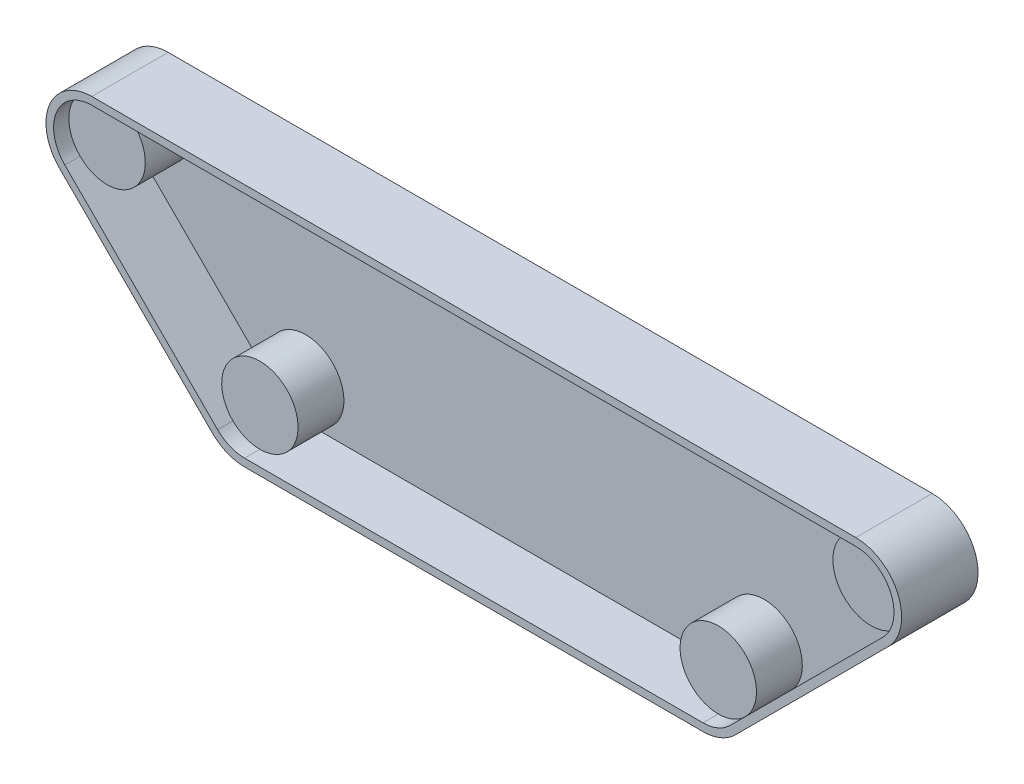
ISO-10303-21;
HEADER;
FILE_DESCRIPTION(('STEP AP214'),'2;1');
FILE_NAME('part.step','',(''),(''),'','','');
FILE_SCHEMA(('AUTOMOTIVE_DESIGN { 1 0 10303 214 1 1 1 1 }'));
ENDSEC;
DATA;
#1=APPLICATION_CONTEXT('core data for automotive mechanical design processes');
#2=APPLICATION_PROTOCOL_DEFINITION('international standard','automotive_design',2000,#1);
#3=PRODUCT_CONTEXT('',#1,'mechanical');
#4=PRODUCT('Part','Part','',(#3));
#5=PRODUCT_RELATED_PRODUCT_CATEGORY('part','',(#4));
#6=PRODUCT_DEFINITION_FORMATION('','',#4);
#7=PRODUCT_DEFINITION_CONTEXT('part definition',#1,'design');
#8=PRODUCT_DEFINITION('design','',#6,#7);
#9=PRODUCT_DEFINITION_SHAPE('','',#8);
#10=(LENGTH_UNIT() NAMED_UNIT(*) SI_UNIT(.MILLI.,.METRE.));
#11=(NAMED_UNIT(*) PLANE_ANGLE_UNIT() SI_UNIT($,.RADIAN.));
#12=(NAMED_UNIT(*) SI_UNIT($,.STERADIAN.) SOLID_ANGLE_UNIT());
#13=UNCERTAINTY_MEASURE_WITH_UNIT(LENGTH_MEASURE(1.E-05),#10,'distance_accuracy_value','');
#14=(GEOMETRIC_REPRESENTATION_CONTEXT(3) GLOBAL_UNCERTAINTY_ASSIGNED_CONTEXT((#13)) GLOBAL_UNIT_ASSIGNED_CONTEXT((#10,
#11,#12)) REPRESENTATION_CONTEXT('',''));
#15=CARTESIAN_POINT('',(0.,0.,0.));
#16=DIRECTION('',(0.,0.,1.));
#17=DIRECTION('',(1.,0.,0.));
#18=AXIS2_PLACEMENT_3D('',#15,#16,#17);
#19=CARTESIAN_POINT('',(653.250308045558,-782.235242423836,20.));
#20=DIRECTION('',(0.707106781186548,0.707106781186548,0.));
#21=DIRECTION('',(-0.707106781186548,0.707106781186548,0.));
#22=AXIS2_PLACEMENT_3D('',#19,#20,#21);
#23=PLANE('',#22);
#24=DIRECTION('',(0.707106781186548,-0.707106781186548,0.));
#25=VECTOR('',#24,1.);
#26=CARTESIAN_POINT('',(653.250308045558,-782.235242423836,0.));
#27=LINE('',#26,#25);
#28=CARTESIAN_POINT('',(-99.828128835988,-29.1568055422896,0.));
#29=VERTEX_POINT('',#28);
#30=CARTESIAN_POINT('',(100.171871164014,-229.156805542292,0.));
#31=VERTEX_POINT('',#30);
#32=EDGE_CURVE('E299',#29,#31,#27,.T.);
#33=ORIENTED_EDGE('',*,*,#32,.T.);
#34=DIRECTION('',(0.,0.,-1.));
#35=VECTOR('',#34,1.);
#36=CARTESIAN_POINT('',(100.171871164014,-229.156805542292,20.));
#37=LINE('',#36,#35);
#38=CARTESIAN_POINT('',(100.171871164014,-229.156805542291,100.));
#39=VERTEX_POINT('',#38);
#40=EDGE_CURVE('E11',#39,#31,#37,.T.);
#41=ORIENTED_EDGE('',*,*,#40,.F.);
#42=DIRECTION('',(0.707106781186548,-0.707106781186548,0.));
#43=VECTOR('',#42,1.);
#44=CARTESIAN_POINT('',(653.250308045559,-782.235242423837,100.));
#45=LINE('',#44,#43);
#46=CARTESIAN_POINT('',(-99.8281288359881,-29.1568055422896,100.));
#47=VERTEX_POINT('',#46);
#48=EDGE_CURVE('E213',#47,#39,#45,.T.);
#49=ORIENTED_EDGE('',*,*,#48,.F.);
#50=DIRECTION('',(0.,0.,-1.));
#51=VECTOR('',#50,1.);
#52=CARTESIAN_POINT('',(-99.828128835988,-29.1568055422896,20.));
#53=LINE('',#52,#51);
#54=EDGE_CURVE('E320',#47,#29,#53,.T.);
#55=ORIENTED_EDGE('',*,*,#54,.T.);
#56=EDGE_LOOP('',(#33,#41,#49,#55));
#57=FACE_BOUND('',#56,.T.);
#58=ADVANCED_FACE('F35',(#57),#23,.F.);
#59=CARTESIAN_POINT('',(142.598278035209,-186.730398671096,20.));
#60=DIRECTION('',(0.,0.,-1.));
#61=DIRECTION('',(-1.,0.,0.));
#62=AXIS2_PLACEMENT_3D('',#59,#60,#61);
#63=CYLINDRICAL_SURFACE('',#62,60.);
#64=CARTESIAN_POINT('',(142.598278035209,-186.730398671096,0.));
#65=DIRECTION('',(0.,0.,1.));
#66=DIRECTION('',(1.,0.,0.));
#67=AXIS2_PLACEMENT_3D('',#64,#65,#66);
#68=CIRCLE('',#67,60.);
#69=CARTESIAN_POINT('',(142.598278035209,-246.730398671096,0.));
#70=VERTEX_POINT('',#69);
#71=EDGE_CURVE('E305',#31,#70,#68,.T.);
#72=ORIENTED_EDGE('',*,*,#71,.T.);
#73=DIRECTION('',(0.,0.,-1.));
#74=VECTOR('',#73,1.);
#75=CARTESIAN_POINT('',(142.598278035209,-246.730398671096,20.));
#76=LINE('',#75,#74);
#77=CARTESIAN_POINT('',(142.598278035209,-246.730398671098,100.));
#78=VERTEX_POINT('',#77);
#79=EDGE_CURVE('E42',#78,#70,#76,.T.);
#80=ORIENTED_EDGE('',*,*,#79,.F.);
#81=CARTESIAN_POINT('',(142.598278035201,-186.730398671104,100.));
#82=DIRECTION('',(0.,0.,1.));
#83=DIRECTION('',(1.,0.,0.));
#84=AXIS2_PLACEMENT_3D('',#81,#82,#83);
#85=CIRCLE('',#84,59.9999999999951);
#86=EDGE_CURVE('E196',#39,#78,#85,.T.);
#87=ORIENTED_EDGE('',*,*,#86,.F.);
#88=ORIENTED_EDGE('',*,*,#40,.T.);
#89=EDGE_LOOP('',(#72,#80,#87,#88));
#90=FACE_BOUND('',#89,.T.);
#91=ADVANCED_FACE('F330',(#90),#63,.T.);
#92=CARTESIAN_POINT('',(442.598278035204,-246.730398671096,20.));
#93=DIRECTION('',(0.,-1.,0.));
#94=DIRECTION('',(0.,0.,-1.));
#95=AXIS2_PLACEMENT_3D('',#92,#93,#94);
#96=PLANE('',#95);
#97=DIRECTION('',(-1.,0.,0.));
#98=VECTOR('',#97,1.);
#99=CARTESIAN_POINT('',(442.598278035204,-246.730398671096,0.));
#100=LINE('',#99,#98);
#101=CARTESIAN_POINT('',(742.598278035208,-246.730398671096,0.));
#102=VERTEX_POINT('',#101);
#103=EDGE_CURVE('E177',#102,#70,#100,.T.);
#104=ORIENTED_EDGE('',*,*,#103,.F.);
#105=DIRECTION('',(0.,0.,-1.));
#106=VECTOR('',#105,1.);
#107=CARTESIAN_POINT('',(742.598278035208,-246.730398671096,20.));
#108=LINE('',#107,#106);
#109=CARTESIAN_POINT('',(742.598278035208,-246.730398671096,100.));
#110=VERTEX_POINT('',#109);
#111=EDGE_CURVE('E171',#110,#102,#108,.T.);
#112=ORIENTED_EDGE('',*,*,#111,.F.);
#113=DIRECTION('',(1.,0.,0.));
#114=VECTOR('',#113,1.);
#115=CARTESIAN_POINT('',(442.598278035204,-246.730398671096,100.));
#116=LINE('',#115,#114);
#117=EDGE_CURVE('E175',#78,#110,#116,.T.);
#118=ORIENTED_EDGE('',*,*,#117,.F.);
#119=ORIENTED_EDGE('',*,*,#79,.T.);
#120=EDGE_LOOP('',(#104,#112,#118,#119));
#121=FACE_BOUND('',#120,.T.);
#122=ADVANCED_FACE('F173',(#121),#96,.T.);
#123=CARTESIAN_POINT('',(742.598278035208,-186.730398671096,20.));
#124=DIRECTION('',(0.,0.,-1.));
#125=DIRECTION('',(-1.,0.,0.));
#126=AXIS2_PLACEMENT_3D('',#123,#124,#125);
#127=CYLINDRICAL_SURFACE('',#126,60.);
#128=CARTESIAN_POINT('',(742.598278035208,-186.730398671096,0.));
#129=DIRECTION('',(0.,0.,1.));
#130=DIRECTION('',(1.,0.,0.));
#131=AXIS2_PLACEMENT_3D('',#128,#129,#130);
#132=CIRCLE('',#131,60.);
#133=CARTESIAN_POINT('',(785.024684906401,-229.156805542289,0.));
#134=VERTEX_POINT('',#133);
#135=EDGE_CURVE('E309',#102,#134,#132,.T.);
#136=ORIENTED_EDGE('',*,*,#135,.T.);
#137=DIRECTION('',(0.,0.,-1.));
#138=VECTOR('',#137,1.);
#139=CARTESIAN_POINT('',(785.024684906401,-229.156805542289,20.));
#140=LINE('',#139,#138);
#141=CARTESIAN_POINT('',(785.024684906401,-229.156805542289,100.));
#142=VERTEX_POINT('',#141);
#143=EDGE_CURVE('E180',#142,#134,#140,.T.);
#144=ORIENTED_EDGE('',*,*,#143,.F.);
#145=CARTESIAN_POINT('',(742.598278035207,-186.730398671096,100.));
#146=DIRECTION('',(0.,0.,1.));
#147=DIRECTION('',(1.,0.,0.));
#148=AXIS2_PLACEMENT_3D('',#145,#146,#147);
#149=CIRCLE('',#148,60.0000000000002);
#150=EDGE_CURVE('E183',#110,#142,#149,.T.);
#151=ORIENTED_EDGE('',*,*,#150,.F.);
#152=ORIENTED_EDGE('',*,*,#111,.T.);
#153=EDGE_LOOP('',(#136,#144,#151,#152));
#154=FACE_BOUND('',#153,.T.);
#155=ADVANCED_FACE('F184',(#154),#127,.T.);
#156=CARTESIAN_POINT('',(231.946248024855,-782.235242423844,20.));
#157=DIRECTION('',(-0.707106781186553,0.707106781186542,0.));
#158=DIRECTION('',(-0.707106781186542,-0.707106781186553,0.));
#159=AXIS2_PLACEMENT_3D('',#156,#157,#158);
#160=PLANE('',#159);
#161=DIRECTION('',(0.707106781186542,0.707106781186553,0.));
#162=VECTOR('',#161,1.);
#163=CARTESIAN_POINT('',(231.946248024855,-782.235242423844,0.));
#164=LINE('',#163,#162);
#165=CARTESIAN_POINT('',(985.024684906398,-29.1568055422885,0.));
#166=VERTEX_POINT('',#165);
#167=EDGE_CURVE('E311',#134,#166,#164,.T.);
#168=ORIENTED_EDGE('',*,*,#167,.T.);
#169=DIRECTION('',(0.,0.,-1.));
#170=VECTOR('',#169,1.);
#171=CARTESIAN_POINT('',(985.024684906398,-29.1568055422885,20.));
#172=LINE('',#171,#170);
#173=CARTESIAN_POINT('',(985.024684906398,-29.1568055422885,100.));
#174=VERTEX_POINT('',#173);
#175=EDGE_CURVE('E326',#174,#166,#172,.T.);
#176=ORIENTED_EDGE('',*,*,#175,.F.);
#177=DIRECTION('',(0.707106781186542,0.707106781186553,0.));
#178=VECTOR('',#177,1.);
#179=CARTESIAN_POINT('',(231.946248024854,-782.235242423845,100.));
#180=LINE('',#179,#178);
#181=EDGE_CURVE('E189',#142,#174,#180,.T.);
#182=ORIENTED_EDGE('',*,*,#181,.F.);
#183=ORIENTED_EDGE('',*,*,#143,.T.);
#184=EDGE_LOOP('',(#168,#176,#182,#183));
#185=FACE_BOUND('',#184,.T.);
#186=ADVANCED_FACE('F337',(#185),#160,.F.);
#187=CARTESIAN_POINT('',(942.598278035204,13.2696013289036,20.));
#188=DIRECTION('',(0.,0.,-1.));
#189=DIRECTION('',(-1.,0.,0.));
#190=AXIS2_PLACEMENT_3D('',#187,#188,#189);
#191=CYLINDRICAL_SURFACE('',#190,60.0000000000001);
#192=CARTESIAN_POINT('',(942.598278035204,13.2696013289036,0.));
#193=DIRECTION('',(0.,0.,1.));
#194=DIRECTION('',(1.,0.,0.));
#195=AXIS2_PLACEMENT_3D('',#192,#193,#194);
#196=CIRCLE('',#195,60.0000000000001);
#197=CARTESIAN_POINT('',(942.598278035204,73.2696013289038,0.));
#198=VERTEX_POINT('',#197);
#199=EDGE_CURVE('E313',#166,#198,#196,.T.);
#200=ORIENTED_EDGE('',*,*,#199,.T.);
#201=DIRECTION('',(0.,0.,-1.));
#202=VECTOR('',#201,1.);
#203=CARTESIAN_POINT('',(942.598278035204,73.2696013289038,20.));
#204=LINE('',#203,#202);
#205=CARTESIAN_POINT('',(942.598278035204,73.2696013289038,100.));
#206=VERTEX_POINT('',#205);
#207=EDGE_CURVE('E324',#206,#198,#204,.T.);
#208=ORIENTED_EDGE('',*,*,#207,.F.);
#209=CARTESIAN_POINT('',(942.598278035204,13.2696013289036,100.));
#210=DIRECTION('',(0.,0.,1.));
#211=DIRECTION('',(1.,0.,0.));
#212=AXIS2_PLACEMENT_3D('',#209,#210,#211);
#213=CIRCLE('',#212,60.0000000000001);
#214=EDGE_CURVE('E204',#174,#206,#213,.T.);
#215=ORIENTED_EDGE('',*,*,#214,.F.);
#216=ORIENTED_EDGE('',*,*,#175,.T.);
#217=EDGE_LOOP('',(#200,#208,#215,#216));
#218=FACE_BOUND('',#217,.T.);
#219=ADVANCED_FACE('F341',(#218),#191,.T.);
#220=CARTESIAN_POINT('',(442.598278035204,73.2696013289037,20.));
#221=DIRECTION('',(0.,1.,0.));
#222=DIRECTION('',(-1.,0.,0.));
#223=AXIS2_PLACEMENT_3D('',#220,#221,#222);
#224=PLANE('',#223);
#225=DIRECTION('',(1.,0.,0.));
#226=VECTOR('',#225,1.);
#227=CARTESIAN_POINT('',(442.598278035204,73.2696013289037,0.));
#228=LINE('',#227,#226);
#229=CARTESIAN_POINT('',(-57.4017219647957,73.2696013289036,0.));
#230=VERTEX_POINT('',#229);
#231=EDGE_CURVE('E316',#230,#198,#228,.T.);
#232=ORIENTED_EDGE('',*,*,#231,.F.);
#233=DIRECTION('',(0.,0.,-1.));
#234=VECTOR('',#233,1.);
#235=CARTESIAN_POINT('',(-57.4017219647957,73.2696013289036,20.));
#236=LINE('',#235,#234);
#237=CARTESIAN_POINT('',(-57.4017219647957,73.2696013289036,100.));
#238=VERTEX_POINT('',#237);
#239=EDGE_CURVE('E322',#238,#230,#236,.T.);
#240=ORIENTED_EDGE('',*,*,#239,.F.);
#241=DIRECTION('',(-1.,0.,0.));
#242=VECTOR('',#241,1.);
#243=CARTESIAN_POINT('',(442.598278035204,73.2696013289038,100.));
#244=LINE('',#243,#242);
#245=EDGE_CURVE('E207',#206,#238,#244,.T.);
#246=ORIENTED_EDGE('',*,*,#245,.F.);
#247=ORIENTED_EDGE('',*,*,#207,.T.);
#248=EDGE_LOOP('',(#232,#240,#246,#247));
#249=FACE_BOUND('',#248,.T.);
#250=ADVANCED_FACE('F344',(#249),#224,.T.);
#251=CARTESIAN_POINT('',(-57.4017219647957,13.2696013289036,20.));
#252=DIRECTION('',(0.,0.,-1.));
#253=DIRECTION('',(-1.,0.,0.));
#254=AXIS2_PLACEMENT_3D('',#251,#252,#253);
#255=CYLINDRICAL_SURFACE('',#254,60.);
#256=CARTESIAN_POINT('',(-57.4017219647957,13.2696013289036,0.));
#257=DIRECTION('',(0.,0.,1.));
#258=DIRECTION('',(1.,0.,0.));
#259=AXIS2_PLACEMENT_3D('',#256,#257,#258);
#260=CIRCLE('',#259,60.);
#261=EDGE_CURVE('E57',#230,#29,#260,.T.);
#262=ORIENTED_EDGE('',*,*,#261,.T.);
#263=ORIENTED_EDGE('',*,*,#54,.F.);
#264=CARTESIAN_POINT('',(-57.4017219647957,13.2696013289036,100.));
#265=DIRECTION('',(0.,0.,1.));
#266=DIRECTION('',(1.,0.,0.));
#267=AXIS2_PLACEMENT_3D('',#264,#265,#266);
#268=CIRCLE('',#267,59.9999999999999);
#269=EDGE_CURVE('E210',#238,#47,#268,.T.);
#270=ORIENTED_EDGE('',*,*,#269,.F.);
#271=ORIENTED_EDGE('',*,*,#239,.T.);
#272=EDGE_LOOP('',(#262,#263,#270,#271));
#273=FACE_BOUND('',#272,.T.);
#274=ADVANCED_FACE('F347',(#273),#255,.T.);
#275=CARTESIAN_POINT('',(442.598278035204,-992.88727243419,0.));
#276=DIRECTION('',(0.,0.,1.));
#277=DIRECTION('',(1.,0.,0.));
#278=AXIS2_PLACEMENT_3D('',#275,#276,#277);
#279=PLANE('',#278);
#280=ORIENTED_EDGE('',*,*,#32,.F.);
#281=ORIENTED_EDGE('',*,*,#261,.F.);
#282=ORIENTED_EDGE('',*,*,#231,.T.);
#283=ORIENTED_EDGE('',*,*,#199,.F.);
#284=ORIENTED_EDGE('',*,*,#167,.F.);
#285=ORIENTED_EDGE('',*,*,#135,.F.);
#286=ORIENTED_EDGE('',*,*,#103,.T.);
#287=ORIENTED_EDGE('',*,*,#71,.F.);
#288=EDGE_LOOP('',(#280,#281,#282,#283,#284,#285,#286,#287));
#289=FACE_BOUND('',#288,.T.);
#290=ADVANCED_FACE('F333',(#289),#279,.F.);
#291=CARTESIAN_POINT('',(442.598278035204,63.2696013289038,100.));
#292=DIRECTION('',(0.,-1.,0.));
#293=DIRECTION('',(0.,0.,-1.));
#294=AXIS2_PLACEMENT_3D('',#291,#292,#293);
#295=PLANE('',#294);
#296=DIRECTION('',(-1.,0.,0.));
#297=VECTOR('',#296,1.);
#298=CARTESIAN_POINT('',(442.598278035204,63.2696013289038,20.));
#299=LINE('',#298,#297);
#300=CARTESIAN_POINT('',(942.598278035204,63.2696013289038,20.));
#301=VERTEX_POINT('',#300);
#302=CARTESIAN_POINT('',(-57.4017219647957,63.2696013289038,20.));
#303=VERTEX_POINT('',#302);
#304=EDGE_CURVE('E237',#301,#303,#299,.T.);
#305=ORIENTED_EDGE('',*,*,#304,.F.);
#306=DIRECTION('',(0.,0.,-1.));
#307=VECTOR('',#306,1.);
#308=CARTESIAN_POINT('',(942.598278035204,63.2696013289038,100.));
#309=LINE('',#308,#307);
#310=CARTESIAN_POINT('',(942.598278035204,63.2696013289038,80.));
#311=VERTEX_POINT('',#310);
#312=EDGE_CURVE('E272',#311,#301,#309,.T.);
#313=ORIENTED_EDGE('',*,*,#312,.F.);
#314=CARTESIAN_POINT('',(942.598278035204,63.2696013289038,100.));
#315=VERTEX_POINT('',#314);
#316=EDGE_CURVE('E49',#315,#311,#309,.T.);
#317=ORIENTED_EDGE('',*,*,#316,.F.);
#318=DIRECTION('',(-1.,0.,0.));
#319=VECTOR('',#318,1.);
#320=CARTESIAN_POINT('',(442.598278035204,63.2696013289038,100.));
#321=LINE('',#320,#319);
#322=CARTESIAN_POINT('',(-57.4017219647957,63.2696013289038,100.));
#323=VERTEX_POINT('',#322);
#324=EDGE_CURVE('E216',#315,#323,#321,.T.);
#325=ORIENTED_EDGE('',*,*,#324,.T.);
#326=DIRECTION('',(0.,0.,-1.));
#327=VECTOR('',#326,1.);
#328=CARTESIAN_POINT('',(-57.4017219647957,63.2696013289038,100.));
#329=LINE('',#328,#327);
#330=CARTESIAN_POINT('',(-57.4017219647957,63.2696013289038,80.));
#331=VERTEX_POINT('',#330);
#332=EDGE_CURVE('E245',#323,#331,#329,.T.);
#333=ORIENTED_EDGE('',*,*,#332,.T.);
#334=EDGE_CURVE('E236',#331,#303,#329,.T.);
#335=ORIENTED_EDGE('',*,*,#334,.T.);
#336=EDGE_LOOP('',(#305,#313,#317,#325,#333,#335));
#337=FACE_BOUND('',#336,.T.);
#338=ADVANCED_FACE('F370',(#337),#295,.T.);
#339=CARTESIAN_POINT('',(942.598278035204,13.2696013289036,100.));
#340=DIRECTION('',(0.,0.,-1.));
#341=DIRECTION('',(-1.,0.,0.));
#342=AXIS2_PLACEMENT_3D('',#339,#340,#341);
#343=CYLINDRICAL_SURFACE('',#342,50.0000000000002);
#344=CARTESIAN_POINT('',(942.598278035204,13.2696013289036,80.));
#345=DIRECTION('',(0.,0.,1.));
#346=DIRECTION('',(1.,0.,0.));
#347=AXIS2_PLACEMENT_3D('',#344,#345,#346);
#348=CIRCLE('',#347,50.0000000000002);
#349=CARTESIAN_POINT('',(977.953617094532,-22.0857377304234,80.));
#350=VERTEX_POINT('',#349);
#351=EDGE_CURVE('E279',#350,#311,#348,.T.);
#352=ORIENTED_EDGE('',*,*,#351,.F.);
#353=DIRECTION('',(0.,0.,-1.));
#354=VECTOR('',#353,1.);
#355=CARTESIAN_POINT('',(977.953617094532,-22.0857377304234,100.));
#356=LINE('',#355,#354);
#357=CARTESIAN_POINT('',(977.953617094532,-22.0857377304234,100.));
#358=VERTEX_POINT('',#357);
#359=EDGE_CURVE('E269',#358,#350,#356,.T.);
#360=ORIENTED_EDGE('',*,*,#359,.F.);
#361=CARTESIAN_POINT('',(942.598278035204,13.2696013289036,100.));
#362=DIRECTION('',(0.,0.,1.));
#363=DIRECTION('',(1.,0.,0.));
#364=AXIS2_PLACEMENT_3D('',#361,#362,#363);
#365=CIRCLE('',#364,50.0000000000002);
#366=EDGE_CURVE('E219',#315,#358,#365,.F.);
#367=ORIENTED_EDGE('',*,*,#366,.F.);
#368=ORIENTED_EDGE('',*,*,#316,.T.);
#369=EDGE_LOOP('',(#352,#360,#367,#368));
#370=FACE_BOUND('',#369,.T.);
#371=ADVANCED_FACE('F409',(#370),#343,.F.);
#372=CARTESIAN_POINT('',(224.875180212988,-775.164174611979,100.));
#373=DIRECTION('',(-0.707106781186553,0.707106781186542,0.));
#374=DIRECTION('',(-0.707106781186542,-0.707106781186553,0.));
#375=AXIS2_PLACEMENT_3D('',#372,#373,#374);
#376=PLANE('',#375);
#377=DIRECTION('',(0.707106781186542,0.707106781186553,0.));
#378=VECTOR('',#377,1.);
#379=CARTESIAN_POINT('',(224.875180212988,-775.164174611979,20.));
#380=LINE('',#379,#378);
#381=CARTESIAN_POINT('',(777.953617094535,-222.085737730423,20.));
#382=VERTEX_POINT('',#381);
#383=CARTESIAN_POINT('',(977.953617094532,-22.0857377304234,20.));
#384=VERTEX_POINT('',#383);
#385=EDGE_CURVE('E240',#382,#384,#380,.T.);
#386=ORIENTED_EDGE('',*,*,#385,.F.);
#387=DIRECTION('',(0.,0.,-1.));
#388=VECTOR('',#387,1.);
#389=CARTESIAN_POINT('',(777.953617094535,-222.085737730423,100.));
#390=LINE('',#389,#388);
#391=CARTESIAN_POINT('',(777.953617094535,-222.085737730423,80.));
#392=VERTEX_POINT('',#391);
#393=EDGE_CURVE('E264',#392,#382,#390,.T.);
#394=ORIENTED_EDGE('',*,*,#393,.F.);
#395=CARTESIAN_POINT('',(777.953617094535,-222.085737730423,100.));
#396=VERTEX_POINT('',#395);
#397=EDGE_CURVE('E265',#396,#392,#390,.T.);
#398=ORIENTED_EDGE('',*,*,#397,.F.);
#399=DIRECTION('',(0.707106781186542,0.707106781186553,0.));
#400=VECTOR('',#399,1.);
#401=CARTESIAN_POINT('',(224.875180212988,-775.164174611979,100.));
#402=LINE('',#401,#400);
#403=EDGE_CURVE('E221',#396,#358,#402,.T.);
#404=ORIENTED_EDGE('',*,*,#403,.T.);
#405=ORIENTED_EDGE('',*,*,#359,.T.);
#406=EDGE_CURVE('E268',#350,#384,#356,.T.);
#407=ORIENTED_EDGE('',*,*,#406,.T.);
#408=EDGE_LOOP('',(#386,#394,#398,#404,#405,#407));
#409=FACE_BOUND('',#408,.T.);
#410=ADVANCED_FACE('F413',(#409),#376,.T.);
#411=CARTESIAN_POINT('',(742.598278035208,-186.730398671096,100.));
#412=DIRECTION('',(0.,0.,-1.));
#413=DIRECTION('',(-1.,0.,0.));
#414=AXIS2_PLACEMENT_3D('',#411,#412,#413);
#415=CYLINDRICAL_SURFACE('',#414,49.9999999999999);
#416=CARTESIAN_POINT('',(742.598278035208,-186.730398671096,80.));
#417=DIRECTION('',(0.,0.,1.));
#418=DIRECTION('',(1.,0.,0.));
#419=AXIS2_PLACEMENT_3D('',#416,#417,#418);
#420=CIRCLE('',#419,49.9999999999999);
#421=CARTESIAN_POINT('',(742.598278035208,-236.730398671096,80.));
#422=VERTEX_POINT('',#421);
#423=EDGE_CURVE('E282',#422,#392,#420,.T.);
#424=ORIENTED_EDGE('',*,*,#423,.F.);
#425=DIRECTION('',(0.,0.,-1.));
#426=VECTOR('',#425,1.);
#427=CARTESIAN_POINT('',(742.598278035208,-236.730398671096,100.));
#428=LINE('',#427,#426);
#429=CARTESIAN_POINT('',(742.598278035208,-236.730398671096,100.));
#430=VERTEX_POINT('',#429);
#431=EDGE_CURVE('E261',#430,#422,#428,.T.);
#432=ORIENTED_EDGE('',*,*,#431,.F.);
#433=CARTESIAN_POINT('',(742.598278035208,-186.730398671096,100.));
#434=DIRECTION('',(0.,0.,1.));
#435=DIRECTION('',(1.,0.,0.));
#436=AXIS2_PLACEMENT_3D('',#433,#434,#435);
#437=CIRCLE('',#436,49.9999999999999);
#438=EDGE_CURVE('E224',#396,#430,#437,.F.);
#439=ORIENTED_EDGE('',*,*,#438,.F.);
#440=ORIENTED_EDGE('',*,*,#397,.T.);
#441=EDGE_LOOP('',(#424,#432,#439,#440));
#442=FACE_BOUND('',#441,.T.);
#443=ADVANCED_FACE('F416',(#442),#415,.F.);
#444=CARTESIAN_POINT('',(442.598278035204,-236.730398671096,100.));
#445=DIRECTION('',(0.,1.,0.));
#446=DIRECTION('',(0.,0.,1.));
#447=AXIS2_PLACEMENT_3D('',#444,#445,#446);
#448=PLANE('',#447);
#449=DIRECTION('',(1.,0.,0.));
#450=VECTOR('',#449,1.);
#451=CARTESIAN_POINT('',(442.598278035204,-236.730398671096,20.));
#452=LINE('',#451,#450);
#453=CARTESIAN_POINT('',(142.598278035202,-236.730398671096,20.));
#454=VERTEX_POINT('',#453);
#455=CARTESIAN_POINT('',(742.598278035208,-236.730398671096,20.));
#456=VERTEX_POINT('',#455);
#457=EDGE_CURVE('E200',#454,#456,#452,.T.);
#458=ORIENTED_EDGE('',*,*,#457,.F.);
#459=DIRECTION('',(0.,0.,-1.));
#460=VECTOR('',#459,1.);
#461=CARTESIAN_POINT('',(142.598278035202,-236.730398671096,100.));
#462=LINE('',#461,#460);
#463=CARTESIAN_POINT('',(142.598278035202,-236.730398671096,80.));
#464=VERTEX_POINT('',#463);
#465=EDGE_CURVE('E256',#464,#454,#462,.T.);
#466=ORIENTED_EDGE('',*,*,#465,.F.);
#467=CARTESIAN_POINT('',(142.598278035202,-236.730398671096,100.));
#468=VERTEX_POINT('',#467);
#469=EDGE_CURVE('E257',#468,#464,#462,.T.);
#470=ORIENTED_EDGE('',*,*,#469,.F.);
#471=DIRECTION('',(1.,0.,0.));
#472=VECTOR('',#471,1.);
#473=CARTESIAN_POINT('',(442.598278035204,-236.730398671096,100.));
#474=LINE('',#473,#472);
#475=EDGE_CURVE('E226',#468,#430,#474,.T.);
#476=ORIENTED_EDGE('',*,*,#475,.T.);
#477=ORIENTED_EDGE('',*,*,#431,.T.);
#478=EDGE_CURVE('E260',#422,#456,#428,.T.);
#479=ORIENTED_EDGE('',*,*,#478,.T.);
#480=EDGE_LOOP('',(#458,#466,#470,#476,#477,#479));
#481=FACE_BOUND('',#480,.T.);
#482=ADVANCED_FACE('F420',(#481),#448,.T.);
#483=CARTESIAN_POINT('',(142.598278035202,-186.730398671102,100.));
#484=DIRECTION('',(0.,0.,-1.));
#485=DIRECTION('',(-1.,0.,0.));
#486=AXIS2_PLACEMENT_3D('',#483,#484,#485);
#487=CYLINDRICAL_SURFACE('',#486,49.9999999999941);
#488=CARTESIAN_POINT('',(142.598278035202,-186.730398671102,80.));
#489=DIRECTION('',(0.,0.,1.));
#490=DIRECTION('',(1.,0.,0.));
#491=AXIS2_PLACEMENT_3D('',#488,#489,#490);
#492=CIRCLE('',#491,49.9999999999941);
#493=CARTESIAN_POINT('',(107.242938975879,-222.085737730425,80.));
#494=VERTEX_POINT('',#493);
#495=EDGE_CURVE('E289',#494,#464,#492,.T.);
#496=ORIENTED_EDGE('',*,*,#495,.F.);
#497=DIRECTION('',(0.,0.,-1.));
#498=VECTOR('',#497,1.);
#499=CARTESIAN_POINT('',(107.242938975879,-222.085737730425,100.));
#500=LINE('',#499,#498);
#501=CARTESIAN_POINT('',(107.242938975879,-222.085737730425,100.));
#502=VERTEX_POINT('',#501);
#503=EDGE_CURVE('E253',#502,#494,#500,.T.);
#504=ORIENTED_EDGE('',*,*,#503,.F.);
#505=CARTESIAN_POINT('',(142.598278035202,-186.730398671102,100.));
#506=DIRECTION('',(0.,0.,1.));
#507=DIRECTION('',(1.,0.,0.));
#508=AXIS2_PLACEMENT_3D('',#505,#506,#507);
#509=CIRCLE('',#508,49.9999999999941);
#510=EDGE_CURVE('E229',#468,#502,#509,.F.);
#511=ORIENTED_EDGE('',*,*,#510,.F.);
#512=ORIENTED_EDGE('',*,*,#469,.T.);
#513=EDGE_LOOP('',(#496,#504,#511,#512));
#514=FACE_BOUND('',#513,.T.);
#515=ADVANCED_FACE('F424',(#514),#487,.F.);
#516=CARTESIAN_POINT('',(660.321375857425,-775.164174611971,100.));
#517=DIRECTION('',(0.707106781186548,0.707106781186548,0.));
#518=DIRECTION('',(-0.707106781186548,0.707106781186548,0.));
#519=AXIS2_PLACEMENT_3D('',#516,#517,#518);
#520=PLANE('',#519);
#521=DIRECTION('',(0.707106781186548,-0.707106781186548,0.));
#522=VECTOR('',#521,1.);
#523=CARTESIAN_POINT('',(660.321375857425,-775.164174611971,20.));
#524=LINE('',#523,#522);
#525=CARTESIAN_POINT('',(-92.757061024123,-22.0857377304237,20.));
#526=VERTEX_POINT('',#525);
#527=CARTESIAN_POINT('',(107.242938975879,-222.085737730425,20.));
#528=VERTEX_POINT('',#527);
#529=EDGE_CURVE('E197',#526,#528,#524,.T.);
#530=ORIENTED_EDGE('',*,*,#529,.F.);
#531=DIRECTION('',(0.,0.,-1.));
#532=VECTOR('',#531,1.);
#533=CARTESIAN_POINT('',(-92.757061024123,-22.0857377304237,100.));
#534=LINE('',#533,#532);
#535=CARTESIAN_POINT('',(-92.757061024123,-22.0857377304237,80.));
#536=VERTEX_POINT('',#535);
#537=EDGE_CURVE('E248',#536,#526,#534,.T.);
#538=ORIENTED_EDGE('',*,*,#537,.F.);
#539=CARTESIAN_POINT('',(-92.757061024123,-22.0857377304237,100.));
#540=VERTEX_POINT('',#539);
#541=EDGE_CURVE('E249',#540,#536,#534,.T.);
#542=ORIENTED_EDGE('',*,*,#541,.F.);
#543=DIRECTION('',(0.707106781186548,-0.707106781186548,0.));
#544=VECTOR('',#543,1.);
#545=CARTESIAN_POINT('',(660.321375857425,-775.164174611971,100.));
#546=LINE('',#545,#544);
#547=EDGE_CURVE('E231',#540,#502,#546,.T.);
#548=ORIENTED_EDGE('',*,*,#547,.T.);
#549=ORIENTED_EDGE('',*,*,#503,.T.);
#550=EDGE_CURVE('E252',#494,#528,#500,.T.);
#551=ORIENTED_EDGE('',*,*,#550,.T.);
#552=EDGE_LOOP('',(#530,#538,#542,#548,#549,#551));
#553=FACE_BOUND('',#552,.T.);
#554=ADVANCED_FACE('F428',(#553),#520,.T.);
#555=CARTESIAN_POINT('',(-57.4017219647957,13.2696013289036,100.));
#556=DIRECTION('',(0.,0.,-1.));
#557=DIRECTION('',(-1.,0.,0.));
#558=AXIS2_PLACEMENT_3D('',#555,#556,#557);
#559=CYLINDRICAL_SURFACE('',#558,50.);
#560=CARTESIAN_POINT('',(-57.4017219647957,13.2696013289036,80.));
#561=DIRECTION('',(0.,0.,1.));
#562=DIRECTION('',(1.,0.,0.));
#563=AXIS2_PLACEMENT_3D('',#560,#561,#562);
#564=CIRCLE('',#563,50.);
#565=EDGE_CURVE('E296',#331,#536,#564,.T.);
#566=ORIENTED_EDGE('',*,*,#565,.F.);
#567=ORIENTED_EDGE('',*,*,#332,.F.);
#568=CARTESIAN_POINT('',(-57.4017219647957,13.2696013289036,100.));
#569=DIRECTION('',(0.,0.,1.));
#570=DIRECTION('',(1.,0.,0.));
#571=AXIS2_PLACEMENT_3D('',#568,#569,#570);
#572=CIRCLE('',#571,50.);
#573=EDGE_CURVE('E234',#540,#323,#572,.F.);
#574=ORIENTED_EDGE('',*,*,#573,.F.);
#575=ORIENTED_EDGE('',*,*,#541,.T.);
#576=EDGE_LOOP('',(#566,#567,#574,#575));
#577=FACE_BOUND('',#576,.T.);
#578=ADVANCED_FACE('F432',(#577),#559,.F.);
#579=CARTESIAN_POINT('',(442.598278035204,-992.887272434192,100.));
#580=DIRECTION('',(0.,0.,1.));
#581=DIRECTION('',(1.,0.,0.));
#582=AXIS2_PLACEMENT_3D('',#579,#580,#581);
#583=PLANE('',#582);
#584=ORIENTED_EDGE('',*,*,#117,.T.);
#585=ORIENTED_EDGE('',*,*,#150,.T.);
#586=ORIENTED_EDGE('',*,*,#181,.T.);
#587=ORIENTED_EDGE('',*,*,#214,.T.);
#588=ORIENTED_EDGE('',*,*,#245,.T.);
#589=ORIENTED_EDGE('',*,*,#269,.T.);
#590=ORIENTED_EDGE('',*,*,#48,.T.);
#591=ORIENTED_EDGE('',*,*,#86,.T.);
#592=EDGE_LOOP('',(#584,#585,#586,#587,#588,#589,#590,#591));
#593=FACE_BOUND('',#592,.T.);
#594=ORIENTED_EDGE('',*,*,#324,.F.);
#595=ORIENTED_EDGE('',*,*,#366,.T.);
#596=ORIENTED_EDGE('',*,*,#403,.F.);
#597=ORIENTED_EDGE('',*,*,#438,.T.);
#598=ORIENTED_EDGE('',*,*,#475,.F.);
#599=ORIENTED_EDGE('',*,*,#510,.T.);
#600=ORIENTED_EDGE('',*,*,#547,.F.);
#601=ORIENTED_EDGE('',*,*,#573,.T.);
#602=EDGE_LOOP('',(#594,#595,#596,#597,#598,#599,#600,#601));
#603=FACE_BOUND('',#602,.T.);
#604=ADVANCED_FACE('F192',(#593,#603),#583,.T.);
#605=CARTESIAN_POINT('',(444.616478842568,-935.53933690537,80.));
#606=DIRECTION('',(0.,0.,1.));
#607=DIRECTION('',(1.,0.,0.));
#608=AXIS2_PLACEMENT_3D('',#605,#606,#607);
#609=PLANE('',#608);
#610=EDGE_CURVE('E275',#311,#350,#348,.T.);
#611=ORIENTED_EDGE('',*,*,#610,.T.);
#612=ORIENTED_EDGE('',*,*,#351,.T.);
#613=EDGE_LOOP('',(#611,#612));
#614=FACE_BOUND('',#613,.T.);
#615=ADVANCED_FACE('F402',(#614),#609,.T.);
#616=CARTESIAN_POINT('',(942.598278035204,13.2696013289036,80.));
#617=DIRECTION('',(0.,0.,-1.));
#618=DIRECTION('',(-1.,0.,0.));
#619=AXIS2_PLACEMENT_3D('',#616,#617,#618);
#620=CYLINDRICAL_SURFACE('',#619,50.0000000000002);
#621=ORIENTED_EDGE('',*,*,#610,.F.);
#622=ORIENTED_EDGE('',*,*,#312,.T.);
#623=CARTESIAN_POINT('',(942.598278035204,13.2696013289036,20.));
#624=DIRECTION('',(0.,0.,1.));
#625=DIRECTION('',(1.,0.,0.));
#626=AXIS2_PLACEMENT_3D('',#623,#624,#625);
#627=CIRCLE('',#626,50.0000000000002);
#628=EDGE_CURVE('E274',#301,#384,#627,.T.);
#629=ORIENTED_EDGE('',*,*,#628,.T.);
#630=ORIENTED_EDGE('',*,*,#406,.F.);
#631=EDGE_LOOP('',(#621,#622,#629,#630));
#632=FACE_BOUND('',#631,.T.);
#633=ADVANCED_FACE('F398',(#632),#620,.T.);
#634=CARTESIAN_POINT('',(444.616478842568,-935.53933690537,80.));
#635=DIRECTION('',(0.,0.,1.));
#636=DIRECTION('',(1.,0.,0.));
#637=AXIS2_PLACEMENT_3D('',#634,#635,#636);
#638=PLANE('',#637);
#639=ORIENTED_EDGE('',*,*,#423,.T.);
#640=EDGE_CURVE('E286',#392,#422,#420,.T.);
#641=ORIENTED_EDGE('',*,*,#640,.T.);
#642=EDGE_LOOP('',(#639,#641));
#643=FACE_BOUND('',#642,.T.);
#644=ADVANCED_FACE('F394',(#643),#638,.T.);
#645=CARTESIAN_POINT('',(742.598278035208,-186.730398671096,80.));
#646=DIRECTION('',(0.,0.,-1.));
#647=DIRECTION('',(-1.,0.,0.));
#648=AXIS2_PLACEMENT_3D('',#645,#646,#647);
#649=CYLINDRICAL_SURFACE('',#648,49.9999999999999);
#650=ORIENTED_EDGE('',*,*,#640,.F.);
#651=ORIENTED_EDGE('',*,*,#393,.T.);
#652=CARTESIAN_POINT('',(742.598278035208,-186.730398671096,20.));
#653=DIRECTION('',(0.,0.,1.));
#654=DIRECTION('',(1.,0.,0.));
#655=AXIS2_PLACEMENT_3D('',#652,#653,#654);
#656=CIRCLE('',#655,49.9999999999999);
#657=EDGE_CURVE('E278',#382,#456,#656,.T.);
#658=ORIENTED_EDGE('',*,*,#657,.T.);
#659=ORIENTED_EDGE('',*,*,#478,.F.);
#660=EDGE_LOOP('',(#650,#651,#658,#659));
#661=FACE_BOUND('',#660,.T.);
#662=ADVANCED_FACE('F390',(#661),#649,.T.);
#663=CARTESIAN_POINT('',(444.616478842568,-935.53933690537,80.));
#664=DIRECTION('',(0.,0.,1.));
#665=DIRECTION('',(1.,0.,0.));
#666=AXIS2_PLACEMENT_3D('',#663,#664,#665);
#667=PLANE('',#666);
#668=ORIENTED_EDGE('',*,*,#495,.T.);
#669=EDGE_CURVE('E293',#464,#494,#492,.T.);
#670=ORIENTED_EDGE('',*,*,#669,.T.);
#671=EDGE_LOOP('',(#668,#670));
#672=FACE_BOUND('',#671,.T.);
#673=ADVANCED_FACE('F386',(#672),#667,.T.);
#674=CARTESIAN_POINT('',(142.598278035202,-186.730398671102,80.));
#675=DIRECTION('',(0.,0.,-1.));
#676=DIRECTION('',(-1.,0.,0.));
#677=AXIS2_PLACEMENT_3D('',#674,#675,#676);
#678=CYLINDRICAL_SURFACE('',#677,49.9999999999941);
#679=ORIENTED_EDGE('',*,*,#669,.F.);
#680=ORIENTED_EDGE('',*,*,#465,.T.);
#681=CARTESIAN_POINT('',(142.598278035202,-186.730398671102,20.));
#682=DIRECTION('',(0.,0.,1.));
#683=DIRECTION('',(1.,0.,0.));
#684=AXIS2_PLACEMENT_3D('',#681,#682,#683);
#685=CIRCLE('',#684,49.9999999999941);
#686=EDGE_CURVE('E285',#454,#528,#685,.T.);
#687=ORIENTED_EDGE('',*,*,#686,.T.);
#688=ORIENTED_EDGE('',*,*,#550,.F.);
#689=EDGE_LOOP('',(#679,#680,#687,#688));
#690=FACE_BOUND('',#689,.T.);
#691=ADVANCED_FACE('F382',(#690),#678,.T.);
#692=CARTESIAN_POINT('',(444.616478842568,-935.53933690537,80.));
#693=DIRECTION('',(0.,0.,1.));
#694=DIRECTION('',(1.,0.,0.));
#695=AXIS2_PLACEMENT_3D('',#692,#693,#694);
#696=PLANE('',#695);
#697=ORIENTED_EDGE('',*,*,#565,.T.);
#698=EDGE_CURVE('E300',#536,#331,#564,.T.);
#699=ORIENTED_EDGE('',*,*,#698,.T.);
#700=EDGE_LOOP('',(#697,#699));
#701=FACE_BOUND('',#700,.T.);
#702=ADVANCED_FACE('F378',(#701),#696,.T.);
#703=CARTESIAN_POINT('',(-57.4017219647957,13.2696013289036,80.));
#704=DIRECTION('',(0.,0.,-1.));
#705=DIRECTION('',(-1.,0.,0.));
#706=AXIS2_PLACEMENT_3D('',#703,#704,#705);
#707=CYLINDRICAL_SURFACE('',#706,50.);
#708=ORIENTED_EDGE('',*,*,#334,.F.);
#709=ORIENTED_EDGE('',*,*,#698,.F.);
#710=ORIENTED_EDGE('',*,*,#537,.T.);
#711=CARTESIAN_POINT('',(-57.4017219647957,13.2696013289036,20.));
#712=DIRECTION('',(0.,0.,1.));
#713=DIRECTION('',(1.,0.,0.));
#714=AXIS2_PLACEMENT_3D('',#711,#712,#713);
#715=CIRCLE('',#714,50.);
#716=EDGE_CURVE('E292',#526,#303,#715,.T.);
#717=ORIENTED_EDGE('',*,*,#716,.T.);
#718=EDGE_LOOP('',(#708,#709,#710,#717));
#719=FACE_BOUND('',#718,.T.);
#720=ADVANCED_FACE('F374',(#719),#707,.T.);
#721=CARTESIAN_POINT('',(442.598278035204,-992.88727243419,20.));
#722=DIRECTION('',(0.,0.,1.));
#723=DIRECTION('',(1.,0.,0.));
#724=AXIS2_PLACEMENT_3D('',#721,#722,#723);
#725=PLANE('',#724);
#726=ORIENTED_EDGE('',*,*,#304,.T.);
#727=ORIENTED_EDGE('',*,*,#716,.F.);
#728=ORIENTED_EDGE('',*,*,#529,.T.);
#729=ORIENTED_EDGE('',*,*,#686,.F.);
#730=ORIENTED_EDGE('',*,*,#457,.T.);
#731=ORIENTED_EDGE('',*,*,#657,.F.);
#732=ORIENTED_EDGE('',*,*,#385,.T.);
#733=ORIENTED_EDGE('',*,*,#628,.F.);
#734=EDGE_LOOP('',(#726,#727,#728,#729,#730,#731,#732,#733));
#735=FACE_BOUND('',#734,.T.);
#736=ADVANCED_FACE('F371',(#735),#725,.T.);
#737=CLOSED_SHELL('',(#58,#91,#122,#155,#186,#219,#250,#274,#290,#338,#371,#410,#443,#482,#515,
#554,#578,#604,#615,#633,#644,#662,#673,#691,#702,#720,#736));
#738=MANIFOLD_SOLID_BREP('B2',#737);
#739=ADVANCED_BREP_SHAPE_REPRESENTATION('',(#18,#738),#14);
#740=SHAPE_DEFINITION_REPRESENTATION(#9,#739);
ENDSEC;
END-ISO-10303-21;
